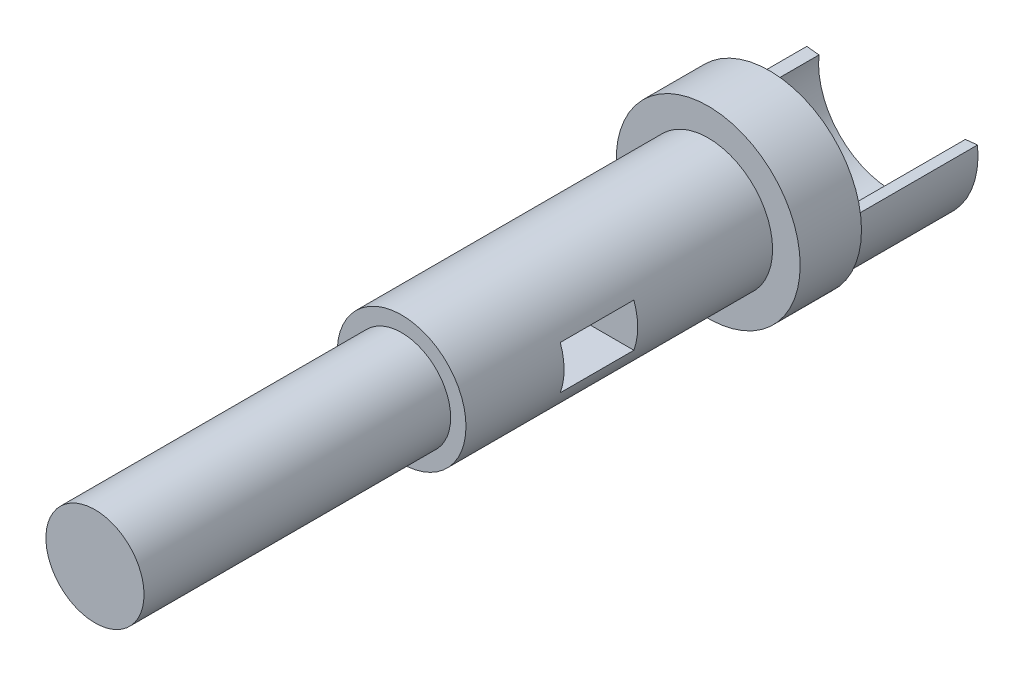
ISO-10303-21;
HEADER;
FILE_DESCRIPTION(('STEP AP214'),'2;1');
FILE_NAME('part.step','',(''),(''),'','','');
FILE_SCHEMA(('AUTOMOTIVE_DESIGN { 1 0 10303 214 1 1 1 1 }'));
ENDSEC;
DATA;
#1=APPLICATION_CONTEXT('core data for automotive mechanical design processes');
#2=APPLICATION_PROTOCOL_DEFINITION('international standard','automotive_design',2000,#1);
#3=PRODUCT_CONTEXT('',#1,'mechanical');
#4=PRODUCT('Part','Part','',(#3));
#5=PRODUCT_RELATED_PRODUCT_CATEGORY('part','',(#4));
#6=PRODUCT_DEFINITION_FORMATION('','',#4);
#7=PRODUCT_DEFINITION_CONTEXT('part definition',#1,'design');
#8=PRODUCT_DEFINITION('design','',#6,#7);
#9=PRODUCT_DEFINITION_SHAPE('','',#8);
#10=(LENGTH_UNIT() NAMED_UNIT(*) SI_UNIT(.MILLI.,.METRE.));
#11=(NAMED_UNIT(*) PLANE_ANGLE_UNIT() SI_UNIT($,.RADIAN.));
#12=(NAMED_UNIT(*) SI_UNIT($,.STERADIAN.) SOLID_ANGLE_UNIT());
#13=UNCERTAINTY_MEASURE_WITH_UNIT(LENGTH_MEASURE(1.E-05),#10,'distance_accuracy_value','');
#14=(GEOMETRIC_REPRESENTATION_CONTEXT(3) GLOBAL_UNCERTAINTY_ASSIGNED_CONTEXT((#13)) GLOBAL_UNIT_ASSIGNED_CONTEXT((#10,
#11,#12)) REPRESENTATION_CONTEXT('',''));
#15=CARTESIAN_POINT('',(0.,0.,0.));
#16=DIRECTION('',(0.,0.,1.));
#17=DIRECTION('',(1.,0.,0.));
#18=AXIS2_PLACEMENT_3D('',#15,#16,#17);
#19=CARTESIAN_POINT('',(0.,0.,0.));
#20=DIRECTION('',(0.,0.,1.));
#21=DIRECTION('',(1.,0.,0.));
#22=AXIS2_PLACEMENT_3D('',#19,#20,#21);
#23=CYLINDRICAL_SURFACE('',#22,10.5);
#24=CARTESIAN_POINT('',(0.,0.,-100.));
#25=DIRECTION('',(0.,0.,1.));
#26=DIRECTION('',(1.,0.,0.));
#27=AXIS2_PLACEMENT_3D('',#24,#25,#26);
#28=CIRCLE('',#27,10.5);
#29=CARTESIAN_POINT('',(10.5,0.,-100.));
#30=VERTEX_POINT('',#29);
#31=EDGE_CURVE('E167',#30,#30,#28,.T.);
#32=ORIENTED_EDGE('',*,*,#31,.T.);
#33=EDGE_LOOP('',(#32));
#34=FACE_BOUND('',#33,.T.);
#35=CARTESIAN_POINT('',(0.,0.,-50.));
#36=DIRECTION('',(0.,0.,1.));
#37=DIRECTION('',(1.,0.,0.));
#38=AXIS2_PLACEMENT_3D('',#35,#36,#37);
#39=CIRCLE('',#38,10.5);
#40=CARTESIAN_POINT('',(10.5,0.,-50.));
#41=VERTEX_POINT('',#40);
#42=EDGE_CURVE('E164',#41,#41,#39,.T.);
#43=ORIENTED_EDGE('',*,*,#42,.F.);
#44=EDGE_LOOP('',(#43));
#45=FACE_BOUND('',#44,.T.);
#46=CARTESIAN_POINT('',(0.,0.,-66.));
#47=DIRECTION('',(0.,0.,-1.));
#48=DIRECTION('',(-1.,0.,0.));
#49=AXIS2_PLACEMENT_3D('',#46,#47,#48);
#50=CIRCLE('',#49,10.5);
#51=CARTESIAN_POINT('',(9.88167495923642,-3.55,-66.));
#52=VERTEX_POINT('',#51);
#53=CARTESIAN_POINT('',(9.88167495923641,3.55,-66.));
#54=VERTEX_POINT('',#53);
#55=EDGE_CURVE('E43',#52,#54,#50,.F.);
#56=ORIENTED_EDGE('',*,*,#55,.T.);
#57=DIRECTION('',(0.,0.,1.));
#58=VECTOR('',#57,1.);
#59=CARTESIAN_POINT('',(9.88167495923642,3.55,0.));
#60=LINE('',#59,#58);
#61=CARTESIAN_POINT('',(9.88167495923641,3.55,-78.));
#62=VERTEX_POINT('',#61);
#63=EDGE_CURVE('E11',#54,#62,#60,.F.);
#64=ORIENTED_EDGE('',*,*,#63,.T.);
#65=CARTESIAN_POINT('',(0.,0.,-78.));
#66=DIRECTION('',(0.,0.,1.));
#67=DIRECTION('',(1.,0.,0.));
#68=AXIS2_PLACEMENT_3D('',#65,#66,#67);
#69=CIRCLE('',#68,10.5);
#70=CARTESIAN_POINT('',(9.88167495923641,-3.55,-78.));
#71=VERTEX_POINT('',#70);
#72=EDGE_CURVE('E176',#62,#71,#69,.F.);
#73=ORIENTED_EDGE('',*,*,#72,.T.);
#74=DIRECTION('',(0.,0.,1.));
#75=VECTOR('',#74,1.);
#76=CARTESIAN_POINT('',(9.88167495923642,-3.55,0.));
#77=LINE('',#76,#75);
#78=EDGE_CURVE('E179',#71,#52,#77,.T.);
#79=ORIENTED_EDGE('',*,*,#78,.T.);
#80=EDGE_LOOP('',(#56,#64,#73,#79));
#81=FACE_BOUND('',#80,.T.);
#82=ADVANCED_FACE('F35',(#34,#45,#81),#23,.T.);
#83=CARTESIAN_POINT('',(0.,0.,-110.));
#84=DIRECTION('',(0.,0.,-1.));
#85=DIRECTION('',(-1.,0.,0.));
#86=AXIS2_PLACEMENT_3D('',#83,#84,#85);
#87=PLANE('',#86);
#88=CARTESIAN_POINT('',(0.,0.,-110.));
#89=DIRECTION('',(0.,0.,1.));
#90=DIRECTION('',(1.,0.,0.));
#91=AXIS2_PLACEMENT_3D('',#88,#89,#90);
#92=CIRCLE('',#91,15.);
#93=CARTESIAN_POINT('',(15.,0.,-110.));
#94=VERTEX_POINT('',#93);
#95=EDGE_CURVE('E173',#94,#94,#92,.T.);
#96=ORIENTED_EDGE('',*,*,#95,.F.);
#97=EDGE_LOOP('',(#96));
#98=FACE_BOUND('',#97,.T.);
#99=DIRECTION('',(-0.994521895368273,0.104528463267654,0.));
#100=VECTOR('',#99,1.);
#101=CARTESIAN_POINT('',(0.,0.,-110.));
#102=LINE('',#101,#100);
#103=CARTESIAN_POINT('',(-11.9342627444193,1.25434155921185,-110.));
#104=VERTEX_POINT('',#103);
#105=CARTESIAN_POINT('',(-13.9233065351558,1.46339848574716,-110.));
#106=VERTEX_POINT('',#105);
#107=EDGE_CURVE('E145',#104,#106,#102,.T.);
#108=ORIENTED_EDGE('',*,*,#107,.T.);
#109=CARTESIAN_POINT('',(0.,0.,-110.));
#110=DIRECTION('',(0.,0.,-1.));
#111=DIRECTION('',(-1.,0.,0.));
#112=AXIS2_PLACEMENT_3D('',#109,#110,#111);
#113=CIRCLE('',#112,14.);
#114=CARTESIAN_POINT('',(13.9233065351558,1.46339848574705,-110.));
#115=VERTEX_POINT('',#114);
#116=EDGE_CURVE('E108',#115,#106,#113,.T.);
#117=ORIENTED_EDGE('',*,*,#116,.F.);
#118=DIRECTION('',(0.994521895368274,0.104528463267646,0.));
#119=VECTOR('',#118,1.);
#120=CARTESIAN_POINT('',(0.,0.,-110.));
#121=LINE('',#120,#119);
#122=CARTESIAN_POINT('',(11.9342627444193,1.25434155921175,-110.));
#123=VERTEX_POINT('',#122);
#124=EDGE_CURVE('E134',#123,#115,#121,.T.);
#125=ORIENTED_EDGE('',*,*,#124,.F.);
#126=CARTESIAN_POINT('',(0.,0.,-110.));
#127=DIRECTION('',(0.,0.,-1.));
#128=DIRECTION('',(-1.,0.,0.));
#129=AXIS2_PLACEMENT_3D('',#126,#127,#128);
#130=CIRCLE('',#129,12.);
#131=EDGE_CURVE('E58',#123,#104,#130,.T.);
#132=ORIENTED_EDGE('',*,*,#131,.T.);
#133=EDGE_LOOP('',(#108,#117,#125,#132));
#134=FACE_BOUND('',#133,.T.);
#135=ADVANCED_FACE('F37',(#98,#134),#87,.T.);
#136=CARTESIAN_POINT('',(0.,0.,0.));
#137=DIRECTION('',(0.,0.,1.));
#138=DIRECTION('',(1.,0.,0.));
#139=AXIS2_PLACEMENT_3D('',#136,#137,#138);
#140=CYLINDRICAL_SURFACE('',#139,15.);
#141=ORIENTED_EDGE('',*,*,#95,.T.);
#142=EDGE_LOOP('',(#141));
#143=FACE_BOUND('',#142,.T.);
#144=CARTESIAN_POINT('',(0.,0.,-100.));
#145=DIRECTION('',(0.,0.,1.));
#146=DIRECTION('',(1.,0.,0.));
#147=AXIS2_PLACEMENT_3D('',#144,#145,#146);
#148=CIRCLE('',#147,15.);
#149=CARTESIAN_POINT('',(15.,0.,-100.));
#150=VERTEX_POINT('',#149);
#151=EDGE_CURVE('E170',#150,#150,#148,.T.);
#152=ORIENTED_EDGE('',*,*,#151,.F.);
#153=EDGE_LOOP('',(#152));
#154=FACE_BOUND('',#153,.T.);
#155=ADVANCED_FACE('F199',(#143,#154),#140,.T.);
#156=CARTESIAN_POINT('',(10.5,0.,-100.));
#157=DIRECTION('',(0.,0.,1.));
#158=DIRECTION('',(1.,0.,0.));
#159=AXIS2_PLACEMENT_3D('',#156,#157,#158);
#160=PLANE('',#159);
#161=ORIENTED_EDGE('',*,*,#151,.T.);
#162=EDGE_LOOP('',(#161));
#163=FACE_BOUND('',#162,.T.);
#164=ORIENTED_EDGE('',*,*,#31,.F.);
#165=EDGE_LOOP('',(#164));
#166=FACE_BOUND('',#165,.T.);
#167=ADVANCED_FACE('F206',(#163,#166),#160,.T.);
#168=CARTESIAN_POINT('',(8.,0.,-50.));
#169=DIRECTION('',(0.,0.,1.));
#170=DIRECTION('',(1.,0.,0.));
#171=AXIS2_PLACEMENT_3D('',#168,#169,#170);
#172=PLANE('',#171);
#173=ORIENTED_EDGE('',*,*,#42,.T.);
#174=EDGE_LOOP('',(#173));
#175=FACE_BOUND('',#174,.T.);
#176=CARTESIAN_POINT('',(0.,0.,-50.));
#177=DIRECTION('',(0.,0.,1.));
#178=DIRECTION('',(1.,0.,0.));
#179=AXIS2_PLACEMENT_3D('',#176,#177,#178);
#180=CIRCLE('',#179,8.);
#181=CARTESIAN_POINT('',(8.,0.,-50.));
#182=VERTEX_POINT('',#181);
#183=EDGE_CURVE('E161',#182,#182,#180,.T.);
#184=ORIENTED_EDGE('',*,*,#183,.F.);
#185=EDGE_LOOP('',(#184));
#186=FACE_BOUND('',#185,.T.);
#187=ADVANCED_FACE('F204',(#175,#186),#172,.T.);
#188=CARTESIAN_POINT('',(0.,0.,0.));
#189=DIRECTION('',(0.,0.,1.));
#190=DIRECTION('',(1.,0.,0.));
#191=AXIS2_PLACEMENT_3D('',#188,#189,#190);
#192=CYLINDRICAL_SURFACE('',#191,8.);
#193=ORIENTED_EDGE('',*,*,#183,.T.);
#194=EDGE_LOOP('',(#193));
#195=FACE_BOUND('',#194,.T.);
#196=CARTESIAN_POINT('',(0.,0.,0.));
#197=DIRECTION('',(0.,0.,1.));
#198=DIRECTION('',(1.,0.,0.));
#199=AXIS2_PLACEMENT_3D('',#196,#197,#198);
#200=CIRCLE('',#199,8.);
#201=CARTESIAN_POINT('',(8.,0.,0.));
#202=VERTEX_POINT('',#201);
#203=EDGE_CURVE('E158',#202,#202,#200,.T.);
#204=ORIENTED_EDGE('',*,*,#203,.F.);
#205=EDGE_LOOP('',(#204));
#206=FACE_BOUND('',#205,.T.);
#207=ADVANCED_FACE('F255',(#195,#206),#192,.T.);
#208=CARTESIAN_POINT('',(0.,0.,0.));
#209=DIRECTION('',(0.,0.,1.));
#210=DIRECTION('',(1.,0.,0.));
#211=AXIS2_PLACEMENT_3D('',#208,#209,#210);
#212=PLANE('',#211);
#213=ORIENTED_EDGE('',*,*,#203,.T.);
#214=EDGE_LOOP('',(#213));
#215=FACE_BOUND('',#214,.T.);
#216=ADVANCED_FACE('F253',(#215),#212,.T.);
#217=CARTESIAN_POINT('',(0.,0.,-130.));
#218=DIRECTION('',(0.,0.,1.));
#219=DIRECTION('',(1.,0.,0.));
#220=AXIS2_PLACEMENT_3D('',#217,#218,#219);
#221=CYLINDRICAL_SURFACE('',#220,14.);
#222=ORIENTED_EDGE('',*,*,#116,.T.);
#223=DIRECTION('',(0.,0.,1.));
#224=VECTOR('',#223,1.);
#225=CARTESIAN_POINT('',(-13.9233065351558,1.46339848574716,-130.));
#226=LINE('',#225,#224);
#227=CARTESIAN_POINT('',(-13.9233065351558,1.46339848574716,-130.));
#228=VERTEX_POINT('',#227);
#229=EDGE_CURVE('E156',#228,#106,#226,.T.);
#230=ORIENTED_EDGE('',*,*,#229,.F.);
#231=CARTESIAN_POINT('',(0.,0.,-130.));
#232=DIRECTION('',(0.,0.,-1.));
#233=DIRECTION('',(-1.,0.,0.));
#234=AXIS2_PLACEMENT_3D('',#231,#232,#233);
#235=CIRCLE('',#234,14.);
#236=CARTESIAN_POINT('',(13.9233065351558,1.46339848574705,-130.));
#237=VERTEX_POINT('',#236);
#238=EDGE_CURVE('E131',#237,#228,#235,.T.);
#239=ORIENTED_EDGE('',*,*,#238,.F.);
#240=DIRECTION('',(0.,0.,1.));
#241=VECTOR('',#240,1.);
#242=CARTESIAN_POINT('',(13.9233065351558,1.46339848574705,-130.));
#243=LINE('',#242,#241);
#244=EDGE_CURVE('E142',#237,#115,#243,.T.);
#245=ORIENTED_EDGE('',*,*,#244,.T.);
#246=EDGE_LOOP('',(#222,#230,#239,#245));
#247=FACE_BOUND('',#246,.T.);
#248=ADVANCED_FACE('F228',(#247),#221,.T.);
#249=CARTESIAN_POINT('',(0.,0.,-130.));
#250=DIRECTION('',(0.104528463267654,0.994521895368273,0.));
#251=DIRECTION('',(-0.994521895368273,0.104528463267654,0.));
#252=AXIS2_PLACEMENT_3D('',#249,#250,#251);
#253=PLANE('',#252);
#254=ORIENTED_EDGE('',*,*,#107,.F.);
#255=DIRECTION('',(0.,0.,1.));
#256=VECTOR('',#255,1.);
#257=CARTESIAN_POINT('',(-11.9342627444193,1.25434155921185,-130.));
#258=LINE('',#257,#256);
#259=CARTESIAN_POINT('',(-11.9342627444193,1.25434155921185,-130.));
#260=VERTEX_POINT('',#259);
#261=EDGE_CURVE('E154',#260,#104,#258,.T.);
#262=ORIENTED_EDGE('',*,*,#261,.F.);
#263=DIRECTION('',(-0.994521895368273,0.104528463267654,0.));
#264=VECTOR('',#263,1.);
#265=CARTESIAN_POINT('',(0.,0.,-130.));
#266=LINE('',#265,#264);
#267=EDGE_CURVE('E133',#260,#228,#266,.T.);
#268=ORIENTED_EDGE('',*,*,#267,.T.);
#269=ORIENTED_EDGE('',*,*,#229,.T.);
#270=EDGE_LOOP('',(#254,#262,#268,#269));
#271=FACE_BOUND('',#270,.T.);
#272=ADVANCED_FACE('F223',(#271),#253,.T.);
#273=CARTESIAN_POINT('',(0.,0.,-130.));
#274=DIRECTION('',(0.,0.,1.));
#275=DIRECTION('',(1.,0.,0.));
#276=AXIS2_PLACEMENT_3D('',#273,#274,#275);
#277=CYLINDRICAL_SURFACE('',#276,12.);
#278=ORIENTED_EDGE('',*,*,#131,.F.);
#279=DIRECTION('',(0.,0.,1.));
#280=VECTOR('',#279,1.);
#281=CARTESIAN_POINT('',(11.9342627444193,1.25434155921175,-130.));
#282=LINE('',#281,#280);
#283=CARTESIAN_POINT('',(11.9342627444193,1.25434155921175,-130.));
#284=VERTEX_POINT('',#283);
#285=EDGE_CURVE('E152',#284,#123,#282,.T.);
#286=ORIENTED_EDGE('',*,*,#285,.F.);
#287=CARTESIAN_POINT('',(0.,0.,-130.));
#288=DIRECTION('',(0.,0.,-1.));
#289=DIRECTION('',(-1.,0.,0.));
#290=AXIS2_PLACEMENT_3D('',#287,#288,#289);
#291=CIRCLE('',#290,12.);
#292=EDGE_CURVE('E137',#284,#260,#291,.T.);
#293=ORIENTED_EDGE('',*,*,#292,.T.);
#294=ORIENTED_EDGE('',*,*,#261,.T.);
#295=EDGE_LOOP('',(#278,#286,#293,#294));
#296=FACE_BOUND('',#295,.T.);
#297=ADVANCED_FACE('F234',(#296),#277,.F.);
#298=CARTESIAN_POINT('',(0.,0.,-130.));
#299=DIRECTION('',(0.104528463267646,-0.994521895368274,0.));
#300=DIRECTION('',(0.994521895368274,0.104528463267646,0.));
#301=AXIS2_PLACEMENT_3D('',#298,#299,#300);
#302=PLANE('',#301);
#303=ORIENTED_EDGE('',*,*,#124,.T.);
#304=ORIENTED_EDGE('',*,*,#244,.F.);
#305=DIRECTION('',(0.994521895368274,0.104528463267646,0.));
#306=VECTOR('',#305,1.);
#307=CARTESIAN_POINT('',(0.,0.,-130.));
#308=LINE('',#307,#306);
#309=EDGE_CURVE('E140',#284,#237,#308,.T.);
#310=ORIENTED_EDGE('',*,*,#309,.F.);
#311=ORIENTED_EDGE('',*,*,#285,.T.);
#312=EDGE_LOOP('',(#303,#304,#310,#311));
#313=FACE_BOUND('',#312,.T.);
#314=ADVANCED_FACE('F232',(#313),#302,.F.);
#315=CARTESIAN_POINT('',(0.,0.,-130.));
#316=DIRECTION('',(0.,0.,-1.));
#317=DIRECTION('',(-1.,0.,0.));
#318=AXIS2_PLACEMENT_3D('',#315,#316,#317);
#319=PLANE('',#318);
#320=ORIENTED_EDGE('',*,*,#238,.T.);
#321=ORIENTED_EDGE('',*,*,#267,.F.);
#322=ORIENTED_EDGE('',*,*,#292,.F.);
#323=ORIENTED_EDGE('',*,*,#309,.T.);
#324=EDGE_LOOP('',(#320,#321,#322,#323));
#325=FACE_BOUND('',#324,.T.);
#326=ADVANCED_FACE('F236',(#325),#319,.T.);
#327=CARTESIAN_POINT('',(15.,3.55,-66.));
#328=DIRECTION('',(0.,-1.,0.));
#329=DIRECTION('',(0.,0.,-1.));
#330=AXIS2_PLACEMENT_3D('',#327,#328,#329);
#331=PLANE('',#330);
#332=DIRECTION('',(-1.,0.,0.));
#333=VECTOR('',#332,1.);
#334=CARTESIAN_POINT('',(15.,3.55,-66.));
#335=LINE('',#334,#333);
#336=CARTESIAN_POINT('',(0.,3.55,-66.));
#337=VERTEX_POINT('',#336);
#338=EDGE_CURVE('E100',#54,#337,#335,.T.);
#339=ORIENTED_EDGE('',*,*,#338,.T.);
#340=DIRECTION('',(0.,0.,1.));
#341=VECTOR('',#340,1.);
#342=CARTESIAN_POINT('',(0.,3.55,-66.));
#343=LINE('',#342,#341);
#344=CARTESIAN_POINT('',(0.,3.55,-78.));
#345=VERTEX_POINT('',#344);
#346=EDGE_CURVE('E105',#345,#337,#343,.T.);
#347=ORIENTED_EDGE('',*,*,#346,.F.);
#348=DIRECTION('',(-1.,0.,0.));
#349=VECTOR('',#348,1.);
#350=CARTESIAN_POINT('',(15.,3.55,-78.));
#351=LINE('',#350,#349);
#352=EDGE_CURVE('E127',#62,#345,#351,.T.);
#353=ORIENTED_EDGE('',*,*,#352,.F.);
#354=ORIENTED_EDGE('',*,*,#63,.F.);
#355=EDGE_LOOP('',(#339,#347,#353,#354));
#356=FACE_BOUND('',#355,.T.);
#357=ADVANCED_FACE('F102',(#356),#331,.T.);
#358=CARTESIAN_POINT('',(15.,-3.55,-66.));
#359=DIRECTION('',(0.,0.,-1.));
#360=DIRECTION('',(-1.,0.,0.));
#361=AXIS2_PLACEMENT_3D('',#358,#359,#360);
#362=PLANE('',#361);
#363=DIRECTION('',(-1.,0.,0.));
#364=VECTOR('',#363,1.);
#365=CARTESIAN_POINT('',(15.,-3.55,-66.));
#366=LINE('',#365,#364);
#367=CARTESIAN_POINT('',(0.,-3.55,-66.));
#368=VERTEX_POINT('',#367);
#369=EDGE_CURVE('E109',#52,#368,#366,.T.);
#370=ORIENTED_EDGE('',*,*,#369,.T.);
#371=DIRECTION('',(0.,-1.,0.));
#372=VECTOR('',#371,1.);
#373=CARTESIAN_POINT('',(0.,-3.55,-66.));
#374=LINE('',#373,#372);
#375=EDGE_CURVE('E112',#337,#368,#374,.T.);
#376=ORIENTED_EDGE('',*,*,#375,.F.);
#377=ORIENTED_EDGE('',*,*,#338,.F.);
#378=ORIENTED_EDGE('',*,*,#55,.F.);
#379=EDGE_LOOP('',(#370,#376,#377,#378));
#380=FACE_BOUND('',#379,.T.);
#381=ADVANCED_FACE('F113',(#380),#362,.T.);
#382=CARTESIAN_POINT('',(15.,-3.55,-66.));
#383=DIRECTION('',(0.,1.,0.));
#384=DIRECTION('',(0.,0.,1.));
#385=AXIS2_PLACEMENT_3D('',#382,#383,#384);
#386=PLANE('',#385);
#387=DIRECTION('',(-1.,0.,0.));
#388=VECTOR('',#387,1.);
#389=CARTESIAN_POINT('',(15.,-3.55,-78.));
#390=LINE('',#389,#388);
#391=CARTESIAN_POINT('',(0.,-3.55,-78.));
#392=VERTEX_POINT('',#391);
#393=EDGE_CURVE('E50',#71,#392,#390,.T.);
#394=ORIENTED_EDGE('',*,*,#393,.T.);
#395=DIRECTION('',(0.,0.,-1.));
#396=VECTOR('',#395,1.);
#397=CARTESIAN_POINT('',(0.,-3.55,-66.));
#398=LINE('',#397,#396);
#399=EDGE_CURVE('E118',#368,#392,#398,.T.);
#400=ORIENTED_EDGE('',*,*,#399,.F.);
#401=ORIENTED_EDGE('',*,*,#369,.F.);
#402=ORIENTED_EDGE('',*,*,#78,.F.);
#403=EDGE_LOOP('',(#394,#400,#401,#402));
#404=FACE_BOUND('',#403,.T.);
#405=ADVANCED_FACE('F183',(#404),#386,.T.);
#406=CARTESIAN_POINT('',(15.,3.55,-78.));
#407=DIRECTION('',(0.,0.,1.));
#408=DIRECTION('',(1.,0.,0.));
#409=AXIS2_PLACEMENT_3D('',#406,#407,#408);
#410=PLANE('',#409);
#411=ORIENTED_EDGE('',*,*,#352,.T.);
#412=DIRECTION('',(0.,1.,0.));
#413=VECTOR('',#412,1.);
#414=CARTESIAN_POINT('',(0.,3.55,-78.));
#415=LINE('',#414,#413);
#416=EDGE_CURVE('E122',#392,#345,#415,.T.);
#417=ORIENTED_EDGE('',*,*,#416,.F.);
#418=ORIENTED_EDGE('',*,*,#393,.F.);
#419=ORIENTED_EDGE('',*,*,#72,.F.);
#420=EDGE_LOOP('',(#411,#417,#418,#419));
#421=FACE_BOUND('',#420,.T.);
#422=ADVANCED_FACE('F184',(#421),#410,.T.);
#423=CARTESIAN_POINT('',(0.,0.,0.));
#424=DIRECTION('',(-1.,0.,0.));
#425=DIRECTION('',(0.,0.,1.));
#426=AXIS2_PLACEMENT_3D('',#423,#424,#425);
#427=PLANE('',#426);
#428=ORIENTED_EDGE('',*,*,#346,.T.);
#429=ORIENTED_EDGE('',*,*,#375,.T.);
#430=ORIENTED_EDGE('',*,*,#399,.T.);
#431=ORIENTED_EDGE('',*,*,#416,.T.);
#432=EDGE_LOOP('',(#428,#429,#430,#431));
#433=FACE_BOUND('',#432,.T.);
#434=ADVANCED_FACE('F121',(#433),#427,.F.);
#435=CLOSED_SHELL('',(#82,#135,#155,#167,#187,#207,#216,#248,#272,#297,#314,#326,#357,#381,#405,
#422,#434));
#436=MANIFOLD_SOLID_BREP('B2',#435);
#437=ADVANCED_BREP_SHAPE_REPRESENTATION('',(#18,#436),#14);
#438=SHAPE_DEFINITION_REPRESENTATION(#9,#437);
ENDSEC;
END-ISO-10303-21;
